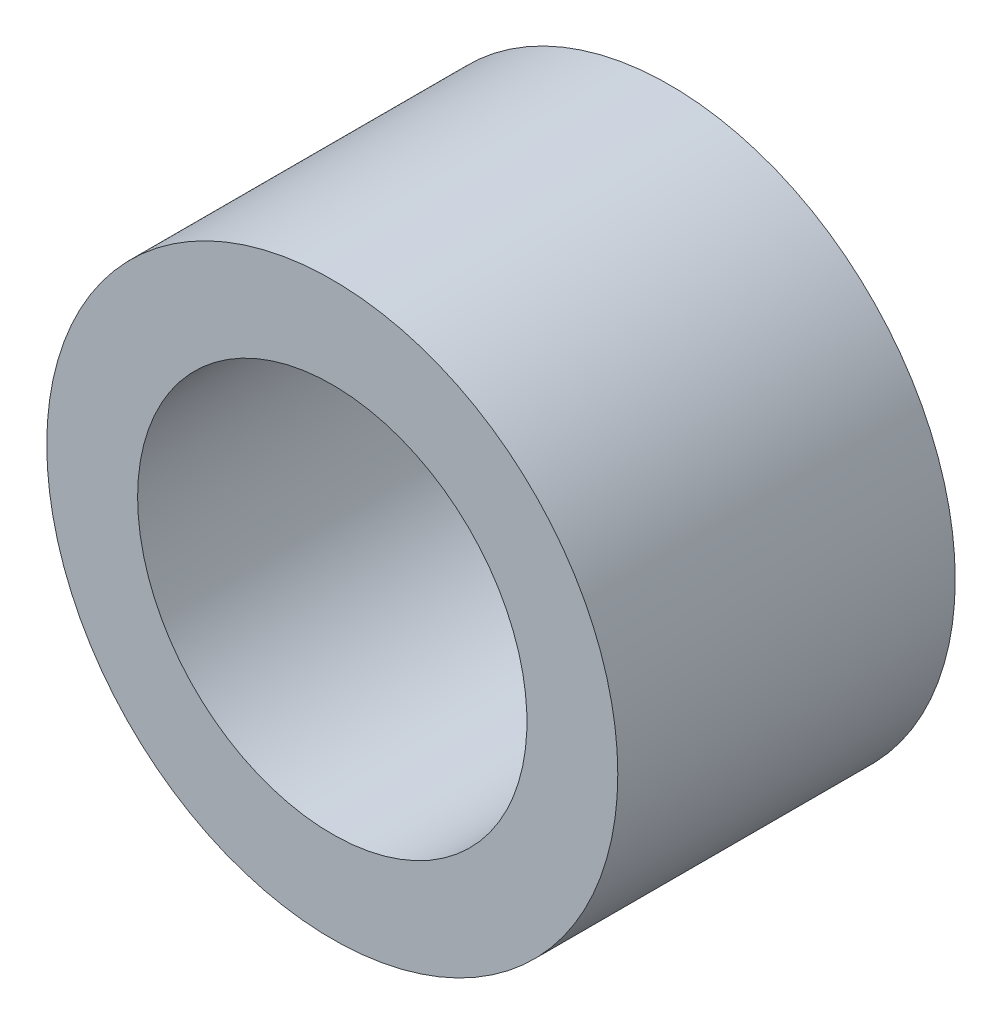
ISO-10303-21;
HEADER;
FILE_DESCRIPTION(('STEP AP214'),'2;1');
FILE_NAME('part.step','',(''),(''),'','','');
FILE_SCHEMA(('AUTOMOTIVE_DESIGN { 1 0 10303 214 1 1 1 1 }'));
ENDSEC;
DATA;
#1=APPLICATION_CONTEXT('core data for automotive mechanical design processes');
#2=APPLICATION_PROTOCOL_DEFINITION('international standard','automotive_design',2000,#1);
#3=PRODUCT_CONTEXT('',#1,'mechanical');
#4=PRODUCT('Part','Part','',(#3));
#5=PRODUCT_RELATED_PRODUCT_CATEGORY('part','',(#4));
#6=PRODUCT_DEFINITION_FORMATION('','',#4);
#7=PRODUCT_DEFINITION_CONTEXT('part definition',#1,'design');
#8=PRODUCT_DEFINITION('design','',#6,#7);
#9=PRODUCT_DEFINITION_SHAPE('','',#8);
#10=(LENGTH_UNIT() NAMED_UNIT(*) SI_UNIT(.MILLI.,.METRE.));
#11=(NAMED_UNIT(*) PLANE_ANGLE_UNIT() SI_UNIT($,.RADIAN.));
#12=(NAMED_UNIT(*) SI_UNIT($,.STERADIAN.) SOLID_ANGLE_UNIT());
#13=UNCERTAINTY_MEASURE_WITH_UNIT(LENGTH_MEASURE(1.E-05),#10,'distance_accuracy_value','');
#14=(GEOMETRIC_REPRESENTATION_CONTEXT(3) GLOBAL_UNCERTAINTY_ASSIGNED_CONTEXT((#13)) GLOBAL_UNIT_ASSIGNED_CONTEXT((#10,
#11,#12)) REPRESENTATION_CONTEXT('',''));
#15=CARTESIAN_POINT('',(0.,0.,0.));
#16=DIRECTION('',(0.,0.,1.));
#17=DIRECTION('',(1.,0.,0.));
#18=AXIS2_PLACEMENT_3D('',#15,#16,#17);
#19=CARTESIAN_POINT('',(0.,0.,-13.));
#20=DIRECTION('',(0.,0.,-1.));
#21=DIRECTION('',(1.,0.,0.));
#22=AXIS2_PLACEMENT_3D('',#19,#20,#21);
#23=PLANE('',#22);
#24=CARTESIAN_POINT('',(0.,0.,-13.));
#25=DIRECTION('',(0.,0.,1.));
#26=DIRECTION('',(1.,0.,0.));
#27=AXIS2_PLACEMENT_3D('',#24,#25,#26);
#28=CIRCLE('',#27,11.);
#29=CARTESIAN_POINT('',(-11.,0.,-13.));
#30=VERTEX_POINT('',#29);
#31=EDGE_CURVE('E10',#30,#30,#28,.T.);
#32=ORIENTED_EDGE('',*,*,#31,.F.);
#33=EDGE_LOOP('',(#32));
#34=FACE_BOUND('',#33,.T.);
#35=CARTESIAN_POINT('',(0.,0.,-13.));
#36=DIRECTION('',(0.,0.,1.));
#37=DIRECTION('',(1.,0.,0.));
#38=AXIS2_PLACEMENT_3D('',#35,#36,#37);
#39=CIRCLE('',#38,7.5);
#40=CARTESIAN_POINT('',(-7.5,0.,-13.));
#41=VERTEX_POINT('',#40);
#42=EDGE_CURVE('E46',#41,#41,#39,.T.);
#43=ORIENTED_EDGE('',*,*,#42,.T.);
#44=EDGE_LOOP('',(#43));
#45=FACE_BOUND('',#44,.T.);
#46=ADVANCED_FACE('F35',(#34,#45),#23,.T.);
#47=CARTESIAN_POINT('',(0.,0.,0.));
#48=DIRECTION('',(0.,0.,-1.));
#49=DIRECTION('',(1.,0.,0.));
#50=AXIS2_PLACEMENT_3D('',#47,#48,#49);
#51=PLANE('',#50);
#52=CARTESIAN_POINT('',(0.,0.,0.));
#53=DIRECTION('',(0.,0.,1.));
#54=DIRECTION('',(1.,0.,0.));
#55=AXIS2_PLACEMENT_3D('',#52,#53,#54);
#56=CIRCLE('',#55,11.);
#57=CARTESIAN_POINT('',(-11.,0.,0.));
#58=VERTEX_POINT('',#57);
#59=EDGE_CURVE('E39',#58,#58,#56,.T.);
#60=ORIENTED_EDGE('',*,*,#59,.T.);
#61=EDGE_LOOP('',(#60));
#62=FACE_BOUND('',#61,.T.);
#63=CARTESIAN_POINT('',(0.,0.,0.));
#64=DIRECTION('',(0.,0.,1.));
#65=DIRECTION('',(1.,0.,0.));
#66=AXIS2_PLACEMENT_3D('',#63,#64,#65);
#67=CIRCLE('',#66,7.5);
#68=CARTESIAN_POINT('',(-7.5,0.,0.));
#69=VERTEX_POINT('',#68);
#70=EDGE_CURVE('E48',#69,#69,#67,.T.);
#71=ORIENTED_EDGE('',*,*,#70,.F.);
#72=EDGE_LOOP('',(#71));
#73=FACE_BOUND('',#72,.T.);
#74=ADVANCED_FACE('F61',(#62,#73),#51,.F.);
#75=CARTESIAN_POINT('',(0.,0.,-13.));
#76=DIRECTION('',(0.,0.,1.));
#77=DIRECTION('',(-1.,0.,0.));
#78=AXIS2_PLACEMENT_3D('',#75,#76,#77);
#79=CYLINDRICAL_SURFACE('',#78,11.);
#80=CARTESIAN_POINT('',(-11.,0.,-13.));
#81=CARTESIAN_POINT('',(-11.,0.,-12.8645833333333));
#82=CARTESIAN_POINT('',(-11.,0.,-12.7291666666667));
#83=CARTESIAN_POINT('',(-11.,0.,-12.4583333333333));
#84=CARTESIAN_POINT('',(-11.,0.,-12.3229166666667));
#85=CARTESIAN_POINT('',(-11.,0.,-12.0520833333333));
#86=CARTESIAN_POINT('',(-11.,0.,-11.9166666666667));
#87=CARTESIAN_POINT('',(-11.,0.,-11.6458333333333));
#88=CARTESIAN_POINT('',(-11.,0.,-11.5104166666667));
#89=CARTESIAN_POINT('',(-11.,0.,-11.2395833333333));
#90=CARTESIAN_POINT('',(-11.,0.,-11.1041666666667));
#91=CARTESIAN_POINT('',(-11.,0.,-10.8333333333333));
#92=CARTESIAN_POINT('',(-11.,0.,-10.6979166666667));
#93=CARTESIAN_POINT('',(-11.,0.,-10.4270833333333));
#94=CARTESIAN_POINT('',(-11.,0.,-10.2916666666667));
#95=CARTESIAN_POINT('',(-11.,0.,-10.0208333333333));
#96=CARTESIAN_POINT('',(-11.,0.,-9.88541666666667));
#97=CARTESIAN_POINT('',(-11.,0.,-9.61458333333333));
#98=CARTESIAN_POINT('',(-11.,0.,-9.47916666666667));
#99=CARTESIAN_POINT('',(-11.,0.,-9.20833333333333));
#100=CARTESIAN_POINT('',(-11.,0.,-9.07291666666667));
#101=CARTESIAN_POINT('',(-11.,0.,-8.80208333333333));
#102=CARTESIAN_POINT('',(-11.,0.,-8.66666666666667));
#103=CARTESIAN_POINT('',(-11.,0.,-8.39583333333333));
#104=CARTESIAN_POINT('',(-11.,0.,-8.26041666666667));
#105=CARTESIAN_POINT('',(-11.,0.,-7.98958333333333));
#106=CARTESIAN_POINT('',(-11.,0.,-7.85416666666667));
#107=CARTESIAN_POINT('',(-11.,0.,-7.58333333333333));
#108=CARTESIAN_POINT('',(-11.,0.,-7.44791666666667));
#109=CARTESIAN_POINT('',(-11.,0.,-7.17708333333333));
#110=CARTESIAN_POINT('',(-11.,0.,-7.04166666666667));
#111=CARTESIAN_POINT('',(-11.,0.,-6.77083333333333));
#112=CARTESIAN_POINT('',(-11.,0.,-6.63541666666667));
#113=CARTESIAN_POINT('',(-11.,0.,-6.36458333333333));
#114=CARTESIAN_POINT('',(-11.,0.,-6.22916666666667));
#115=CARTESIAN_POINT('',(-11.,0.,-5.95833333333333));
#116=CARTESIAN_POINT('',(-11.,0.,-5.82291666666667));
#117=CARTESIAN_POINT('',(-11.,0.,-5.55208333333333));
#118=CARTESIAN_POINT('',(-11.,0.,-5.41666666666667));
#119=CARTESIAN_POINT('',(-11.,0.,-5.14583333333333));
#120=CARTESIAN_POINT('',(-11.,0.,-5.01041666666667));
#121=CARTESIAN_POINT('',(-11.,0.,-4.73958333333333));
#122=CARTESIAN_POINT('',(-11.,0.,-4.60416666666667));
#123=CARTESIAN_POINT('',(-11.,0.,-4.33333333333333));
#124=CARTESIAN_POINT('',(-11.,0.,-4.19791666666667));
#125=CARTESIAN_POINT('',(-11.,0.,-3.92708333333333));
#126=CARTESIAN_POINT('',(-11.,0.,-3.79166666666667));
#127=CARTESIAN_POINT('',(-11.,0.,-3.52083333333333));
#128=CARTESIAN_POINT('',(-11.,0.,-3.38541666666667));
#129=CARTESIAN_POINT('',(-11.,0.,-3.11458333333333));
#130=CARTESIAN_POINT('',(-11.,0.,-2.97916666666667));
#131=CARTESIAN_POINT('',(-11.,0.,-2.70833333333333));
#132=CARTESIAN_POINT('',(-11.,0.,-2.57291666666667));
#133=CARTESIAN_POINT('',(-11.,0.,-2.30208333333333));
#134=CARTESIAN_POINT('',(-11.,0.,-2.16666666666667));
#135=CARTESIAN_POINT('',(-11.,0.,-1.89583333333333));
#136=CARTESIAN_POINT('',(-11.,0.,-1.76041666666667));
#137=CARTESIAN_POINT('',(-11.,0.,-1.48958333333333));
#138=CARTESIAN_POINT('',(-11.,0.,-1.35416666666667));
#139=CARTESIAN_POINT('',(-11.,0.,-1.08333333333333));
#140=CARTESIAN_POINT('',(-11.,0.,-0.947916666666667));
#141=CARTESIAN_POINT('',(-11.,0.,-0.677083333333334));
#142=CARTESIAN_POINT('',(-11.,0.,-0.541666666666667));
#143=CARTESIAN_POINT('',(-11.,0.,-0.270833333333334));
#144=CARTESIAN_POINT('',(-11.,0.,-0.135416666666667));
#145=CARTESIAN_POINT('',(-11.,0.,0.));
#146=B_SPLINE_CURVE_WITH_KNOTS('',3,(#80,#81,#82,#83,#84,#85,#86,#87,#88,#89,#90,#91,#92,#93,
#94,#95,#96,#97,#98,#99,#100,#101,#102,#103,#104,#105,#106,#107,#108,#109,#110,#111,#112,#113,
#114,#115,#116,#117,#118,#119,#120,#121,#122,#123,#124,#125,#126,#127,#128,#129,#130,#131,#132,
#133,#134,#135,#136,#137,#138,#139,#140,#141,#142,#143,#144,#145),.UNSPECIFIED.,.F.,.F.,(4,2,2,
2,2,2,2,2,2,2,2,2,2,2,2,2,2,2,2,2,2,2,2,2,2,2,2,2,2,2,2,2,4),(0.,0.40625,0.812500000000001,
1.21875,1.625,2.03125,2.4375,2.84375,3.25,3.65625,4.0625,4.46875,4.875,5.28125,5.6875,6.09375,
6.5,6.90625,7.3125,7.71875,8.125,8.53125,8.9375,9.34375,9.75,10.15625,10.5625,10.96875,11.375,
11.78125,12.1875,12.59375,13.),.UNSPECIFIED.);
#147=EDGE_CURVE('BSEAM37',#30,#58,#146,.T.);
#148=ORIENTED_EDGE('',*,*,#31,.T.);
#149=ORIENTED_EDGE('',*,*,#59,.F.);
#150=ORIENTED_EDGE('',*,*,#147,.T.);
#151=ORIENTED_EDGE('',*,*,#147,.F.);
#152=EDGE_LOOP('',(#148,#150,#149,#151));
#153=FACE_BOUND('',#152,.T.);
#154=ADVANCED_FACE('F37',(#153),#79,.T.);
#155=CARTESIAN_POINT('',(0.,0.,-13.));
#156=DIRECTION('',(0.,0.,1.));
#157=DIRECTION('',(-1.,0.,0.));
#158=AXIS2_PLACEMENT_3D('',#155,#156,#157);
#159=CYLINDRICAL_SURFACE('',#158,7.5);
#160=CARTESIAN_POINT('',(-7.5,0.,-13.));
#161=CARTESIAN_POINT('',(-7.5,0.,-12.8645833333333));
#162=CARTESIAN_POINT('',(-7.5,0.,-12.7291666666667));
#163=CARTESIAN_POINT('',(-7.5,0.,-12.4583333333333));
#164=CARTESIAN_POINT('',(-7.5,0.,-12.3229166666667));
#165=CARTESIAN_POINT('',(-7.5,0.,-12.0520833333333));
#166=CARTESIAN_POINT('',(-7.5,0.,-11.9166666666667));
#167=CARTESIAN_POINT('',(-7.5,0.,-11.6458333333333));
#168=CARTESIAN_POINT('',(-7.5,0.,-11.5104166666667));
#169=CARTESIAN_POINT('',(-7.5,0.,-11.2395833333333));
#170=CARTESIAN_POINT('',(-7.5,0.,-11.1041666666667));
#171=CARTESIAN_POINT('',(-7.5,0.,-10.8333333333333));
#172=CARTESIAN_POINT('',(-7.5,0.,-10.6979166666667));
#173=CARTESIAN_POINT('',(-7.5,0.,-10.4270833333333));
#174=CARTESIAN_POINT('',(-7.5,0.,-10.2916666666667));
#175=CARTESIAN_POINT('',(-7.5,0.,-10.0208333333333));
#176=CARTESIAN_POINT('',(-7.5,0.,-9.88541666666667));
#177=CARTESIAN_POINT('',(-7.5,0.,-9.61458333333333));
#178=CARTESIAN_POINT('',(-7.5,0.,-9.47916666666667));
#179=CARTESIAN_POINT('',(-7.5,0.,-9.20833333333333));
#180=CARTESIAN_POINT('',(-7.5,0.,-9.07291666666667));
#181=CARTESIAN_POINT('',(-7.5,0.,-8.80208333333333));
#182=CARTESIAN_POINT('',(-7.5,0.,-8.66666666666667));
#183=CARTESIAN_POINT('',(-7.5,0.,-8.39583333333333));
#184=CARTESIAN_POINT('',(-7.5,0.,-8.26041666666667));
#185=CARTESIAN_POINT('',(-7.5,0.,-7.98958333333333));
#186=CARTESIAN_POINT('',(-7.5,0.,-7.85416666666667));
#187=CARTESIAN_POINT('',(-7.5,0.,-7.58333333333333));
#188=CARTESIAN_POINT('',(-7.5,0.,-7.44791666666667));
#189=CARTESIAN_POINT('',(-7.5,0.,-7.17708333333333));
#190=CARTESIAN_POINT('',(-7.5,0.,-7.04166666666667));
#191=CARTESIAN_POINT('',(-7.5,0.,-6.77083333333333));
#192=CARTESIAN_POINT('',(-7.5,0.,-6.63541666666667));
#193=CARTESIAN_POINT('',(-7.5,0.,-6.36458333333333));
#194=CARTESIAN_POINT('',(-7.5,0.,-6.22916666666667));
#195=CARTESIAN_POINT('',(-7.5,0.,-5.95833333333333));
#196=CARTESIAN_POINT('',(-7.5,0.,-5.82291666666667));
#197=CARTESIAN_POINT('',(-7.5,0.,-5.55208333333333));
#198=CARTESIAN_POINT('',(-7.5,0.,-5.41666666666667));
#199=CARTESIAN_POINT('',(-7.5,0.,-5.14583333333333));
#200=CARTESIAN_POINT('',(-7.5,0.,-5.01041666666667));
#201=CARTESIAN_POINT('',(-7.5,0.,-4.73958333333333));
#202=CARTESIAN_POINT('',(-7.5,0.,-4.60416666666667));
#203=CARTESIAN_POINT('',(-7.5,0.,-4.33333333333333));
#204=CARTESIAN_POINT('',(-7.5,0.,-4.19791666666667));
#205=CARTESIAN_POINT('',(-7.5,0.,-3.92708333333333));
#206=CARTESIAN_POINT('',(-7.5,0.,-3.79166666666667));
#207=CARTESIAN_POINT('',(-7.5,0.,-3.52083333333333));
#208=CARTESIAN_POINT('',(-7.5,0.,-3.38541666666667));
#209=CARTESIAN_POINT('',(-7.5,0.,-3.11458333333333));
#210=CARTESIAN_POINT('',(-7.5,0.,-2.97916666666667));
#211=CARTESIAN_POINT('',(-7.5,0.,-2.70833333333333));
#212=CARTESIAN_POINT('',(-7.5,0.,-2.57291666666667));
#213=CARTESIAN_POINT('',(-7.5,0.,-2.30208333333333));
#214=CARTESIAN_POINT('',(-7.5,0.,-2.16666666666667));
#215=CARTESIAN_POINT('',(-7.5,0.,-1.89583333333333));
#216=CARTESIAN_POINT('',(-7.5,0.,-1.76041666666667));
#217=CARTESIAN_POINT('',(-7.5,0.,-1.48958333333333));
#218=CARTESIAN_POINT('',(-7.5,0.,-1.35416666666667));
#219=CARTESIAN_POINT('',(-7.5,0.,-1.08333333333333));
#220=CARTESIAN_POINT('',(-7.5,0.,-0.947916666666667));
#221=CARTESIAN_POINT('',(-7.5,0.,-0.677083333333334));
#222=CARTESIAN_POINT('',(-7.5,0.,-0.541666666666667));
#223=CARTESIAN_POINT('',(-7.5,0.,-0.270833333333334));
#224=CARTESIAN_POINT('',(-7.5,0.,-0.135416666666667));
#225=CARTESIAN_POINT('',(-7.5,0.,0.));
#226=B_SPLINE_CURVE_WITH_KNOTS('',3,(#160,#161,#162,#163,#164,#165,#166,#167,#168,#169,#170,
#171,#172,#173,#174,#175,#176,#177,#178,#179,#180,#181,#182,#183,#184,#185,#186,#187,#188,#189,
#190,#191,#192,#193,#194,#195,#196,#197,#198,#199,#200,#201,#202,#203,#204,#205,#206,#207,#208,
#209,#210,#211,#212,#213,#214,#215,#216,#217,#218,#219,#220,#221,#222,#223,#224,#225),
.UNSPECIFIED.,.F.,.F.,(4,2,2,2,2,2,2,2,2,2,2,2,2,2,2,2,2,2,2,2,2,2,2,2,2,2,2,2,2,2,2,2,4),(0.,
0.40625,0.812500000000001,1.21875,1.625,2.03125,2.4375,2.84375,3.25,3.65625,4.0625,4.46875,
4.875,5.28125,5.6875,6.09375,6.5,6.90625,7.3125,7.71875,8.125,8.53125,8.9375,9.34375,9.75,
10.15625,10.5625,10.96875,11.375,11.78125,12.1875,12.59375,13.),.UNSPECIFIED.);
#227=EDGE_CURVE('BSEAM55',#41,#69,#226,.T.);
#228=ORIENTED_EDGE('',*,*,#42,.F.);
#229=ORIENTED_EDGE('',*,*,#70,.T.);
#230=ORIENTED_EDGE('',*,*,#227,.T.);
#231=ORIENTED_EDGE('',*,*,#227,.F.);
#232=EDGE_LOOP('',(#228,#230,#229,#231));
#233=FACE_BOUND('',#232,.T.);
#234=ADVANCED_FACE('F55',(#233),#159,.F.);
#235=CLOSED_SHELL('',(#46,#74,#154,#234));
#236=MANIFOLD_SOLID_BREP('B2',#235);
#237=ADVANCED_BREP_SHAPE_REPRESENTATION('',(#18,#236),#14);
#238=SHAPE_DEFINITION_REPRESENTATION(#9,#237);
ENDSEC;
END-ISO-10303-21;
